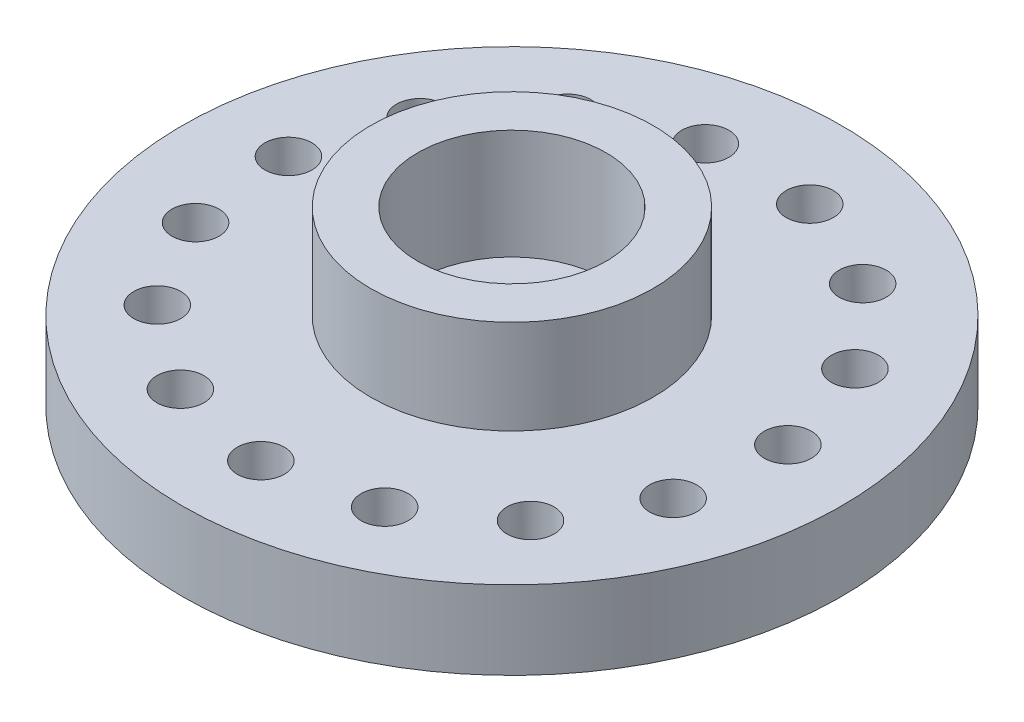
ISO-10303-21;
HEADER;
FILE_DESCRIPTION(('STEP AP214'),'2;1');
FILE_NAME('part.step','',(''),(''),'','','');
FILE_SCHEMA(('AUTOMOTIVE_DESIGN { 1 0 10303 214 1 1 1 1 }'));
ENDSEC;
DATA;
#1=APPLICATION_CONTEXT('core data for automotive mechanical design processes');
#2=APPLICATION_PROTOCOL_DEFINITION('international standard','automotive_design',2000,#1);
#3=PRODUCT_CONTEXT('',#1,'mechanical');
#4=PRODUCT('Part','Part','',(#3));
#5=PRODUCT_RELATED_PRODUCT_CATEGORY('part','',(#4));
#6=PRODUCT_DEFINITION_FORMATION('','',#4);
#7=PRODUCT_DEFINITION_CONTEXT('part definition',#1,'design');
#8=PRODUCT_DEFINITION('design','',#6,#7);
#9=PRODUCT_DEFINITION_SHAPE('','',#8);
#10=(LENGTH_UNIT() NAMED_UNIT(*) SI_UNIT(.MILLI.,.METRE.));
#11=(NAMED_UNIT(*) PLANE_ANGLE_UNIT() SI_UNIT($,.RADIAN.));
#12=(NAMED_UNIT(*) SI_UNIT($,.STERADIAN.) SOLID_ANGLE_UNIT());
#13=UNCERTAINTY_MEASURE_WITH_UNIT(LENGTH_MEASURE(1.E-05),#10,'distance_accuracy_value','');
#14=(GEOMETRIC_REPRESENTATION_CONTEXT(3) GLOBAL_UNCERTAINTY_ASSIGNED_CONTEXT((#13)) GLOBAL_UNIT_ASSIGNED_CONTEXT((#10,
#11,#12)) REPRESENTATION_CONTEXT('',''));
#15=CARTESIAN_POINT('',(0.,0.,0.));
#16=DIRECTION('',(0.,0.,1.));
#17=DIRECTION('',(1.,0.,0.));
#18=AXIS2_PLACEMENT_3D('',#15,#16,#17);
#19=CARTESIAN_POINT('',(0.,2.5,0.));
#20=DIRECTION('',(0.,1.,0.));
#21=DIRECTION('',(0.,0.,1.));
#22=AXIS2_PLACEMENT_3D('',#19,#20,#21);
#23=PLANE('',#22);
#24=CARTESIAN_POINT('',(-3.25389314460638,2.5,7.30836366114067));
#25=DIRECTION('',(0.,1.,0.));
#26=DIRECTION('',(0.,0.,1.));
#27=AXIS2_PLACEMENT_3D('',#24,#25,#26);
#28=CIRCLE('',#27,0.750000000000171);
#29=CARTESIAN_POINT('',(-3.25389314460638,2.5,8.05836366114084));
#30=VERTEX_POINT('',#29);
#31=EDGE_CURVE('E141',#30,#30,#28,.T.);
#32=ORIENTED_EDGE('',*,*,#31,.F.);
#33=EDGE_LOOP('',(#32));
#34=FACE_BOUND('',#33,.T.);
#35=CARTESIAN_POINT('',(-5.94515860381904,2.5,5.35304485087061));
#36=DIRECTION('',(0.,1.,0.));
#37=DIRECTION('',(0.,0.,1.));
#38=AXIS2_PLACEMENT_3D('',#35,#36,#37);
#39=CIRCLE('',#38,0.750000000000277);
#40=CARTESIAN_POINT('',(-5.94515860381904,2.5,6.10304485087089));
#41=VERTEX_POINT('',#40);
#42=EDGE_CURVE('E135',#41,#41,#39,.T.);
#43=ORIENTED_EDGE('',*,*,#42,.F.);
#44=EDGE_LOOP('',(#43));
#45=FACE_BOUND('',#44,.T.);
#46=CARTESIAN_POINT('',(-7.60845213036099,2.5,2.47213595499925));
#47=DIRECTION('',(0.,1.,0.));
#48=DIRECTION('',(0.,0.,1.));
#49=AXIS2_PLACEMENT_3D('',#46,#47,#48);
#50=CIRCLE('',#49,0.750000000000401);
#51=CARTESIAN_POINT('',(-7.60845213036099,2.5,3.22213595499966));
#52=VERTEX_POINT('',#51);
#53=EDGE_CURVE('E129',#52,#52,#50,.T.);
#54=ORIENTED_EDGE('',*,*,#53,.F.);
#55=EDGE_LOOP('',(#54));
#56=FACE_BOUND('',#55,.T.);
#57=CARTESIAN_POINT('',(-7.95617516294581,2.5,-0.836227706141572));
#58=DIRECTION('',(0.,1.,0.));
#59=DIRECTION('',(0.,0.,1.));
#60=AXIS2_PLACEMENT_3D('',#57,#58,#59);
#61=CIRCLE('',#60,0.750000000000539);
#62=CARTESIAN_POINT('',(-7.95617516294581,2.5,-0.0862277061410326));
#63=VERTEX_POINT('',#62);
#64=EDGE_CURVE('E123',#63,#63,#61,.T.);
#65=ORIENTED_EDGE('',*,*,#64,.F.);
#66=EDGE_LOOP('',(#65));
#67=FACE_BOUND('',#66,.T.);
#68=CARTESIAN_POINT('',(-6.928203230275,2.5,-4.0000000000003));
#69=DIRECTION('',(0.,1.,0.));
#70=DIRECTION('',(0.,0.,1.));
#71=AXIS2_PLACEMENT_3D('',#68,#69,#70);
#72=CIRCLE('',#71,0.750000000000647);
#73=CARTESIAN_POINT('',(-6.928203230275,2.5,-3.24999999999965));
#74=VERTEX_POINT('',#73);
#75=EDGE_CURVE('E117',#74,#74,#72,.T.);
#76=ORIENTED_EDGE('',*,*,#75,.F.);
#77=EDGE_LOOP('',(#76));
#78=FACE_BOUND('',#77,.T.);
#79=CARTESIAN_POINT('',(-4.70228201833917,2.5,-6.47213595499978));
#80=DIRECTION('',(0.,1.,0.));
#81=DIRECTION('',(0.,0.,1.));
#82=AXIS2_PLACEMENT_3D('',#79,#80,#81);
#83=CIRCLE('',#82,0.750000000000711);
#84=CARTESIAN_POINT('',(-4.70228201833917,2.5,-5.72213595499907));
#85=VERTEX_POINT('',#84);
#86=EDGE_CURVE('E111',#85,#85,#83,.T.);
#87=ORIENTED_EDGE('',*,*,#86,.F.);
#88=EDGE_LOOP('',(#87));
#89=FACE_BOUND('',#88,.T.);
#90=CARTESIAN_POINT('',(-1.6632935265414,2.5,-7.82518080587052));
#91=DIRECTION('',(0.,1.,0.));
#92=DIRECTION('',(0.,0.,1.));
#93=AXIS2_PLACEMENT_3D('',#90,#91,#92);
#94=CIRCLE('',#93,0.750000000000721);
#95=CARTESIAN_POINT('',(-1.6632935265414,2.5,-7.0751808058698));
#96=VERTEX_POINT('',#95);
#97=EDGE_CURVE('E105',#96,#96,#94,.T.);
#98=ORIENTED_EDGE('',*,*,#97,.F.);
#99=EDGE_LOOP('',(#98));
#100=FACE_BOUND('',#99,.T.);
#101=CARTESIAN_POINT('',(1.66329352654275,2.5,-7.82518080587037));
#102=DIRECTION('',(0.,1.,0.));
#103=DIRECTION('',(0.,0.,1.));
#104=AXIS2_PLACEMENT_3D('',#101,#102,#103);
#105=CIRCLE('',#104,0.750000000000672);
#106=CARTESIAN_POINT('',(1.66329352654275,2.5,-7.0751808058697));
#107=VERTEX_POINT('',#106);
#108=EDGE_CURVE('E99',#107,#107,#105,.T.);
#109=ORIENTED_EDGE('',*,*,#108,.F.);
#110=EDGE_LOOP('',(#109));
#111=FACE_BOUND('',#110,.T.);
#112=CARTESIAN_POINT('',(4.7022820183404,2.5,-6.47213595499938));
#113=DIRECTION('',(0.,1.,0.));
#114=DIRECTION('',(0.,0.,1.));
#115=AXIS2_PLACEMENT_3D('',#112,#113,#114);
#116=CIRCLE('',#115,0.750000000000571);
#117=CARTESIAN_POINT('',(4.7022820183404,2.5,-5.72213595499881));
#118=VERTEX_POINT('',#117);
#119=EDGE_CURVE('E93',#118,#118,#116,.T.);
#120=ORIENTED_EDGE('',*,*,#119,.F.);
#121=EDGE_LOOP('',(#120));
#122=FACE_BOUND('',#121,.T.);
#123=CARTESIAN_POINT('',(6.92820323027602,2.5,-3.9999999999997));
#124=DIRECTION('',(0.,1.,0.));
#125=DIRECTION('',(0.,0.,1.));
#126=AXIS2_PLACEMENT_3D('',#123,#124,#125);
#127=CIRCLE('',#126,0.750000000000439);
#128=CARTESIAN_POINT('',(6.92820323027602,2.5,-3.24999999999927));
#129=VERTEX_POINT('',#128);
#130=EDGE_CURVE('E87',#129,#129,#127,.T.);
#131=ORIENTED_EDGE('',*,*,#130,.F.);
#132=EDGE_LOOP('',(#131));
#133=FACE_BOUND('',#132,.T.);
#134=CARTESIAN_POINT('',(7.95617516294656,2.5,-0.836227706140889));
#135=DIRECTION('',(0.,1.,0.));
#136=DIRECTION('',(0.,0.,1.));
#137=AXIS2_PLACEMENT_3D('',#134,#135,#136);
#138=CIRCLE('',#137,0.750000000000289);
#139=CARTESIAN_POINT('',(7.95617516294656,2.5,-0.0862277061405998));
#140=VERTEX_POINT('',#139);
#141=EDGE_CURVE('E81',#140,#140,#138,.T.);
#142=ORIENTED_EDGE('',*,*,#141,.F.);
#143=EDGE_LOOP('',(#142));
#144=FACE_BOUND('',#143,.T.);
#145=CARTESIAN_POINT('',(7.60845213036146,2.5,2.4721359549999));
#146=DIRECTION('',(0.,1.,0.));
#147=DIRECTION('',(0.,0.,1.));
#148=AXIS2_PLACEMENT_3D('',#145,#146,#147);
#149=CIRCLE('',#148,0.75000000000015);
#150=CARTESIAN_POINT('',(7.60845213036146,2.5,3.22213595500005));
#151=VERTEX_POINT('',#150);
#152=EDGE_CURVE('E75',#151,#151,#149,.T.);
#153=ORIENTED_EDGE('',*,*,#152,.F.);
#154=EDGE_LOOP('',(#153));
#155=FACE_BOUND('',#154,.T.);
#156=CARTESIAN_POINT('',(5.94515860381927,2.5,5.35304485087112));
#157=DIRECTION('',(0.,1.,0.));
#158=DIRECTION('',(0.,0.,1.));
#159=AXIS2_PLACEMENT_3D('',#156,#157,#158);
#160=CIRCLE('',#159,0.750000000000048);
#161=CARTESIAN_POINT('',(5.94515860381927,2.5,6.10304485087117));
#162=VERTEX_POINT('',#161);
#163=EDGE_CURVE('E69',#162,#162,#160,.T.);
#164=ORIENTED_EDGE('',*,*,#163,.F.);
#165=EDGE_LOOP('',(#164));
#166=FACE_BOUND('',#165,.T.);
#167=CARTESIAN_POINT('',(3.25389314460641,2.5,7.3083636611408));
#168=DIRECTION('',(0.,1.,0.));
#169=DIRECTION('',(0.,0.,1.));
#170=AXIS2_PLACEMENT_3D('',#167,#168,#169);
#171=CIRCLE('',#170,0.75);
#172=CARTESIAN_POINT('',(3.25389314460641,2.5,8.0583636611408));
#173=VERTEX_POINT('',#172);
#174=EDGE_CURVE('E63',#173,#173,#171,.T.);
#175=ORIENTED_EDGE('',*,*,#174,.F.);
#176=EDGE_LOOP('',(#175));
#177=FACE_BOUND('',#176,.T.);
#178=CARTESIAN_POINT('',(0.,2.5,8.));
#179=DIRECTION('',(0.,1.,0.));
#180=DIRECTION('',(0.,0.,1.));
#181=AXIS2_PLACEMENT_3D('',#178,#179,#180);
#182=CIRCLE('',#181,0.75);
#183=CARTESIAN_POINT('',(0.,2.5,8.75));
#184=VERTEX_POINT('',#183);
#185=EDGE_CURVE('E55',#184,#184,#182,.T.);
#186=ORIENTED_EDGE('',*,*,#185,.F.);
#187=EDGE_LOOP('',(#186));
#188=FACE_BOUND('',#187,.T.);
#189=CARTESIAN_POINT('',(0.,2.5,0.));
#190=DIRECTION('',(0.,1.,0.));
#191=DIRECTION('',(0.,0.,1.));
#192=AXIS2_PLACEMENT_3D('',#189,#190,#191);
#193=CIRCLE('',#192,10.5);
#194=CARTESIAN_POINT('',(0.,2.5,10.5));
#195=VERTEX_POINT('',#194);
#196=EDGE_CURVE('E10',#195,#195,#193,.T.);
#197=ORIENTED_EDGE('',*,*,#196,.T.);
#198=EDGE_LOOP('',(#197));
#199=FACE_BOUND('',#198,.T.);
#200=CARTESIAN_POINT('',(0.,2.5,0.));
#201=DIRECTION('',(0.,1.,0.));
#202=DIRECTION('',(0.,0.,1.));
#203=AXIS2_PLACEMENT_3D('',#200,#201,#202);
#204=CIRCLE('',#203,4.5);
#205=CARTESIAN_POINT('',(0.,2.5,4.5));
#206=VERTEX_POINT('',#205);
#207=EDGE_CURVE('E46',#206,#206,#204,.T.);
#208=ORIENTED_EDGE('',*,*,#207,.F.);
#209=EDGE_LOOP('',(#208));
#210=FACE_BOUND('',#209,.T.);
#211=ADVANCED_FACE('F33',(#34,#45,#56,#67,#78,#89,#100,#111,#122,#133,#144,#155,#166,#177,#188,
#199,#210),#23,.T.);
#212=CARTESIAN_POINT('',(0.,2.5,0.));
#213=DIRECTION('',(0.,-1.,0.));
#214=DIRECTION('',(0.,0.,-1.));
#215=AXIS2_PLACEMENT_3D('',#212,#213,#214);
#216=CYLINDRICAL_SURFACE('',#215,10.5);
#217=ORIENTED_EDGE('',*,*,#196,.F.);
#218=EDGE_LOOP('',(#217));
#219=FACE_BOUND('',#218,.T.);
#220=CARTESIAN_POINT('',(0.,0.,0.));
#221=DIRECTION('',(0.,1.,0.));
#222=DIRECTION('',(0.,0.,1.));
#223=AXIS2_PLACEMENT_3D('',#220,#221,#222);
#224=CIRCLE('',#223,10.5);
#225=CARTESIAN_POINT('',(0.,0.,10.5));
#226=VERTEX_POINT('',#225);
#227=EDGE_CURVE('E37',#226,#226,#224,.T.);
#228=ORIENTED_EDGE('',*,*,#227,.T.);
#229=EDGE_LOOP('',(#228));
#230=FACE_BOUND('',#229,.T.);
#231=ADVANCED_FACE('F35',(#219,#230),#216,.T.);
#232=CARTESIAN_POINT('',(0.,0.,0.));
#233=DIRECTION('',(0.,1.,0.));
#234=DIRECTION('',(0.,0.,1.));
#235=AXIS2_PLACEMENT_3D('',#232,#233,#234);
#236=PLANE('',#235);
#237=CARTESIAN_POINT('',(-3.25389314460638,0.,7.30836366114067));
#238=DIRECTION('',(0.,-1.,0.));
#239=DIRECTION('',(0.,0.,-1.));
#240=AXIS2_PLACEMENT_3D('',#237,#238,#239);
#241=CIRCLE('',#240,0.750000000000171);
#242=CARTESIAN_POINT('',(-3.25389314460638,0.,6.5583636611405));
#243=VERTEX_POINT('',#242);
#244=EDGE_CURVE('E144',#243,#243,#241,.T.);
#245=ORIENTED_EDGE('',*,*,#244,.F.);
#246=EDGE_LOOP('',(#245));
#247=FACE_BOUND('',#246,.T.);
#248=CARTESIAN_POINT('',(-5.94515860381904,0.,5.35304485087061));
#249=DIRECTION('',(0.,-1.,0.));
#250=DIRECTION('',(0.,0.,-1.));
#251=AXIS2_PLACEMENT_3D('',#248,#249,#250);
#252=CIRCLE('',#251,0.750000000000277);
#253=CARTESIAN_POINT('',(-5.94515860381904,0.,4.60304485087033));
#254=VERTEX_POINT('',#253);
#255=EDGE_CURVE('E138',#254,#254,#252,.T.);
#256=ORIENTED_EDGE('',*,*,#255,.F.);
#257=EDGE_LOOP('',(#256));
#258=FACE_BOUND('',#257,.T.);
#259=CARTESIAN_POINT('',(-7.60845213036099,0.,2.47213595499925));
#260=DIRECTION('',(0.,-1.,0.));
#261=DIRECTION('',(0.,0.,-1.));
#262=AXIS2_PLACEMENT_3D('',#259,#260,#261);
#263=CIRCLE('',#262,0.750000000000401);
#264=CARTESIAN_POINT('',(-7.60845213036099,0.,1.72213595499885));
#265=VERTEX_POINT('',#264);
#266=EDGE_CURVE('E132',#265,#265,#263,.T.);
#267=ORIENTED_EDGE('',*,*,#266,.F.);
#268=EDGE_LOOP('',(#267));
#269=FACE_BOUND('',#268,.T.);
#270=CARTESIAN_POINT('',(-7.95617516294581,0.,-0.836227706141572));
#271=DIRECTION('',(0.,-1.,0.));
#272=DIRECTION('',(0.,0.,-1.));
#273=AXIS2_PLACEMENT_3D('',#270,#271,#272);
#274=CIRCLE('',#273,0.750000000000539);
#275=CARTESIAN_POINT('',(-7.95617516294581,0.,-1.58622770614211));
#276=VERTEX_POINT('',#275);
#277=EDGE_CURVE('E126',#276,#276,#274,.T.);
#278=ORIENTED_EDGE('',*,*,#277,.F.);
#279=EDGE_LOOP('',(#278));
#280=FACE_BOUND('',#279,.T.);
#281=CARTESIAN_POINT('',(-6.928203230275,0.,-4.0000000000003));
#282=DIRECTION('',(0.,-1.,0.));
#283=DIRECTION('',(0.,0.,-1.));
#284=AXIS2_PLACEMENT_3D('',#281,#282,#283);
#285=CIRCLE('',#284,0.750000000000647);
#286=CARTESIAN_POINT('',(-6.928203230275,0.,-4.75000000000095));
#287=VERTEX_POINT('',#286);
#288=EDGE_CURVE('E120',#287,#287,#285,.T.);
#289=ORIENTED_EDGE('',*,*,#288,.F.);
#290=EDGE_LOOP('',(#289));
#291=FACE_BOUND('',#290,.T.);
#292=CARTESIAN_POINT('',(-4.70228201833917,0.,-6.47213595499978));
#293=DIRECTION('',(0.,-1.,0.));
#294=DIRECTION('',(0.,0.,-1.));
#295=AXIS2_PLACEMENT_3D('',#292,#293,#294);
#296=CIRCLE('',#295,0.750000000000711);
#297=CARTESIAN_POINT('',(-4.70228201833917,0.,-7.22213595500049));
#298=VERTEX_POINT('',#297);
#299=EDGE_CURVE('E114',#298,#298,#296,.T.);
#300=ORIENTED_EDGE('',*,*,#299,.F.);
#301=EDGE_LOOP('',(#300));
#302=FACE_BOUND('',#301,.T.);
#303=CARTESIAN_POINT('',(-1.6632935265414,0.,-7.82518080587052));
#304=DIRECTION('',(0.,-1.,0.));
#305=DIRECTION('',(0.,0.,-1.));
#306=AXIS2_PLACEMENT_3D('',#303,#304,#305);
#307=CIRCLE('',#306,0.750000000000721);
#308=CARTESIAN_POINT('',(-1.6632935265414,0.,-8.57518080587124));
#309=VERTEX_POINT('',#308);
#310=EDGE_CURVE('E108',#309,#309,#307,.T.);
#311=ORIENTED_EDGE('',*,*,#310,.F.);
#312=EDGE_LOOP('',(#311));
#313=FACE_BOUND('',#312,.T.);
#314=CARTESIAN_POINT('',(1.66329352654275,0.,-7.82518080587037));
#315=DIRECTION('',(0.,-1.,0.));
#316=DIRECTION('',(0.,0.,-1.));
#317=AXIS2_PLACEMENT_3D('',#314,#315,#316);
#318=CIRCLE('',#317,0.750000000000672);
#319=CARTESIAN_POINT('',(1.66329352654275,0.,-8.57518080587105));
#320=VERTEX_POINT('',#319);
#321=EDGE_CURVE('E102',#320,#320,#318,.T.);
#322=ORIENTED_EDGE('',*,*,#321,.F.);
#323=EDGE_LOOP('',(#322));
#324=FACE_BOUND('',#323,.T.);
#325=CARTESIAN_POINT('',(4.7022820183404,0.,-6.47213595499938));
#326=DIRECTION('',(0.,-1.,0.));
#327=DIRECTION('',(0.,0.,-1.));
#328=AXIS2_PLACEMENT_3D('',#325,#326,#327);
#329=CIRCLE('',#328,0.750000000000571);
#330=CARTESIAN_POINT('',(4.7022820183404,0.,-7.22213595499995));
#331=VERTEX_POINT('',#330);
#332=EDGE_CURVE('E96',#331,#331,#329,.T.);
#333=ORIENTED_EDGE('',*,*,#332,.F.);
#334=EDGE_LOOP('',(#333));
#335=FACE_BOUND('',#334,.T.);
#336=CARTESIAN_POINT('',(6.92820323027602,0.,-3.9999999999997));
#337=DIRECTION('',(0.,-1.,0.));
#338=DIRECTION('',(0.,0.,-1.));
#339=AXIS2_PLACEMENT_3D('',#336,#337,#338);
#340=CIRCLE('',#339,0.750000000000439);
#341=CARTESIAN_POINT('',(6.92820323027602,0.,-4.75000000000014));
#342=VERTEX_POINT('',#341);
#343=EDGE_CURVE('E90',#342,#342,#340,.T.);
#344=ORIENTED_EDGE('',*,*,#343,.F.);
#345=EDGE_LOOP('',(#344));
#346=FACE_BOUND('',#345,.T.);
#347=CARTESIAN_POINT('',(7.95617516294656,0.,-0.836227706140889));
#348=DIRECTION('',(0.,-1.,0.));
#349=DIRECTION('',(0.,0.,-1.));
#350=AXIS2_PLACEMENT_3D('',#347,#348,#349);
#351=CIRCLE('',#350,0.750000000000289);
#352=CARTESIAN_POINT('',(7.95617516294656,0.,-1.58622770614118));
#353=VERTEX_POINT('',#352);
#354=EDGE_CURVE('E84',#353,#353,#351,.T.);
#355=ORIENTED_EDGE('',*,*,#354,.F.);
#356=EDGE_LOOP('',(#355));
#357=FACE_BOUND('',#356,.T.);
#358=CARTESIAN_POINT('',(7.60845213036146,0.,2.4721359549999));
#359=DIRECTION('',(0.,-1.,0.));
#360=DIRECTION('',(0.,0.,-1.));
#361=AXIS2_PLACEMENT_3D('',#358,#359,#360);
#362=CIRCLE('',#361,0.75000000000015);
#363=CARTESIAN_POINT('',(7.60845213036146,0.,1.72213595499975));
#364=VERTEX_POINT('',#363);
#365=EDGE_CURVE('E78',#364,#364,#362,.T.);
#366=ORIENTED_EDGE('',*,*,#365,.F.);
#367=EDGE_LOOP('',(#366));
#368=FACE_BOUND('',#367,.T.);
#369=CARTESIAN_POINT('',(5.94515860381927,0.,5.35304485087112));
#370=DIRECTION('',(0.,-1.,0.));
#371=DIRECTION('',(0.,0.,-1.));
#372=AXIS2_PLACEMENT_3D('',#369,#370,#371);
#373=CIRCLE('',#372,0.750000000000048);
#374=CARTESIAN_POINT('',(5.94515860381927,0.,4.60304485087107));
#375=VERTEX_POINT('',#374);
#376=EDGE_CURVE('E72',#375,#375,#373,.T.);
#377=ORIENTED_EDGE('',*,*,#376,.F.);
#378=EDGE_LOOP('',(#377));
#379=FACE_BOUND('',#378,.T.);
#380=CARTESIAN_POINT('',(3.25389314460641,0.,7.3083636611408));
#381=DIRECTION('',(0.,-1.,0.));
#382=DIRECTION('',(0.,0.,-1.));
#383=AXIS2_PLACEMENT_3D('',#380,#381,#382);
#384=CIRCLE('',#383,0.75);
#385=CARTESIAN_POINT('',(3.25389314460641,0.,6.5583636611408));
#386=VERTEX_POINT('',#385);
#387=EDGE_CURVE('E66',#386,#386,#384,.T.);
#388=ORIENTED_EDGE('',*,*,#387,.F.);
#389=EDGE_LOOP('',(#388));
#390=FACE_BOUND('',#389,.T.);
#391=CARTESIAN_POINT('',(0.,0.,8.));
#392=DIRECTION('',(0.,-1.,0.));
#393=DIRECTION('',(0.,0.,-1.));
#394=AXIS2_PLACEMENT_3D('',#391,#392,#393);
#395=CIRCLE('',#394,0.75);
#396=CARTESIAN_POINT('',(0.,0.,7.25));
#397=VERTEX_POINT('',#396);
#398=EDGE_CURVE('E60',#397,#397,#395,.T.);
#399=ORIENTED_EDGE('',*,*,#398,.F.);
#400=EDGE_LOOP('',(#399));
#401=FACE_BOUND('',#400,.T.);
#402=ORIENTED_EDGE('',*,*,#227,.F.);
#403=EDGE_LOOP('',(#402));
#404=FACE_BOUND('',#403,.T.);
#405=ADVANCED_FACE('F150',(#247,#258,#269,#280,#291,#302,#313,#324,#335,#346,#357,#368,#379,
#390,#401,#404),#236,.F.);
#406=CARTESIAN_POINT('',(0.,5.5,0.));
#407=DIRECTION('',(0.,-1.,0.));
#408=DIRECTION('',(0.,0.,-1.));
#409=AXIS2_PLACEMENT_3D('',#406,#407,#408);
#410=CYLINDRICAL_SURFACE('',#409,4.5);
#411=CARTESIAN_POINT('',(0.,5.5,0.));
#412=DIRECTION('',(0.,1.,0.));
#413=DIRECTION('',(0.,0.,1.));
#414=AXIS2_PLACEMENT_3D('',#411,#412,#413);
#415=CIRCLE('',#414,4.5);
#416=CARTESIAN_POINT('',(0.,5.5,4.5));
#417=VERTEX_POINT('',#416);
#418=EDGE_CURVE('E44',#417,#417,#415,.T.);
#419=ORIENTED_EDGE('',*,*,#418,.F.);
#420=EDGE_LOOP('',(#419));
#421=FACE_BOUND('',#420,.T.);
#422=ORIENTED_EDGE('',*,*,#207,.T.);
#423=EDGE_LOOP('',(#422));
#424=FACE_BOUND('',#423,.T.);
#425=ADVANCED_FACE('F153',(#421,#424),#410,.T.);
#426=CARTESIAN_POINT('',(0.,5.5,0.));
#427=DIRECTION('',(0.,1.,0.));
#428=DIRECTION('',(0.,0.,1.));
#429=AXIS2_PLACEMENT_3D('',#426,#427,#428);
#430=PLANE('',#429);
#431=CARTESIAN_POINT('',(0.,5.5,0.));
#432=DIRECTION('',(0.,1.,0.));
#433=DIRECTION('',(0.,0.,1.));
#434=AXIS2_PLACEMENT_3D('',#431,#432,#433);
#435=CIRCLE('',#434,3.);
#436=CARTESIAN_POINT('',(0.,5.5,3.));
#437=VERTEX_POINT('',#436);
#438=EDGE_CURVE('E52',#437,#437,#435,.T.);
#439=ORIENTED_EDGE('',*,*,#438,.F.);
#440=EDGE_LOOP('',(#439));
#441=FACE_BOUND('',#440,.T.);
#442=ORIENTED_EDGE('',*,*,#418,.T.);
#443=EDGE_LOOP('',(#442));
#444=FACE_BOUND('',#443,.T.);
#445=ADVANCED_FACE('F198',(#441,#444),#430,.T.);
#446=CARTESIAN_POINT('',(0.,2.,0.));
#447=DIRECTION('',(0.,1.,0.));
#448=DIRECTION('',(0.,0.,1.));
#449=AXIS2_PLACEMENT_3D('',#446,#447,#448);
#450=CYLINDRICAL_SURFACE('',#449,3.);
#451=CARTESIAN_POINT('',(0.,2.,0.));
#452=DIRECTION('',(0.,1.,0.));
#453=DIRECTION('',(0.,0.,1.));
#454=AXIS2_PLACEMENT_3D('',#451,#452,#453);
#455=CIRCLE('',#454,3.);
#456=CARTESIAN_POINT('',(0.,2.,3.));
#457=VERTEX_POINT('',#456);
#458=EDGE_CURVE('E49',#457,#457,#455,.T.);
#459=ORIENTED_EDGE('',*,*,#458,.F.);
#460=EDGE_LOOP('',(#459));
#461=FACE_BOUND('',#460,.T.);
#462=ORIENTED_EDGE('',*,*,#438,.T.);
#463=EDGE_LOOP('',(#462));
#464=FACE_BOUND('',#463,.T.);
#465=ADVANCED_FACE('F202',(#461,#464),#450,.F.);
#466=CARTESIAN_POINT('',(0.,2.,0.));
#467=DIRECTION('',(0.,1.,0.));
#468=DIRECTION('',(0.,0.,1.));
#469=AXIS2_PLACEMENT_3D('',#466,#467,#468);
#470=PLANE('',#469);
#471=ORIENTED_EDGE('',*,*,#458,.T.);
#472=EDGE_LOOP('',(#471));
#473=FACE_BOUND('',#472,.T.);
#474=ADVANCED_FACE('F206',(#473),#470,.T.);
#475=CARTESIAN_POINT('',(0.,4.,8.));
#476=DIRECTION('',(0.,-1.,0.));
#477=DIRECTION('',(0.,0.,-1.));
#478=AXIS2_PLACEMENT_3D('',#475,#476,#477);
#479=CYLINDRICAL_SURFACE('',#478,0.75);
#480=ORIENTED_EDGE('',*,*,#185,.T.);
#481=EDGE_LOOP('',(#480));
#482=FACE_BOUND('',#481,.T.);
#483=ORIENTED_EDGE('',*,*,#398,.T.);
#484=EDGE_LOOP('',(#483));
#485=FACE_BOUND('',#484,.T.);
#486=ADVANCED_FACE('F210',(#482,#485),#479,.F.);
#487=CARTESIAN_POINT('',(3.25389314460641,4.,7.3083636611408));
#488=DIRECTION('',(0.,-1.,0.));
#489=DIRECTION('',(0.,0.,-1.));
#490=AXIS2_PLACEMENT_3D('',#487,#488,#489);
#491=CYLINDRICAL_SURFACE('',#490,0.75);
#492=ORIENTED_EDGE('',*,*,#174,.T.);
#493=EDGE_LOOP('',(#492));
#494=FACE_BOUND('',#493,.T.);
#495=ORIENTED_EDGE('',*,*,#387,.T.);
#496=EDGE_LOOP('',(#495));
#497=FACE_BOUND('',#496,.T.);
#498=ADVANCED_FACE('F214',(#494,#497),#491,.F.);
#499=CARTESIAN_POINT('',(5.94515860381927,4.,5.35304485087112));
#500=DIRECTION('',(0.,-1.,0.));
#501=DIRECTION('',(0.,0.,-1.));
#502=AXIS2_PLACEMENT_3D('',#499,#500,#501);
#503=CYLINDRICAL_SURFACE('',#502,0.750000000000048);
#504=ORIENTED_EDGE('',*,*,#163,.T.);
#505=EDGE_LOOP('',(#504));
#506=FACE_BOUND('',#505,.T.);
#507=ORIENTED_EDGE('',*,*,#376,.T.);
#508=EDGE_LOOP('',(#507));
#509=FACE_BOUND('',#508,.T.);
#510=ADVANCED_FACE('F218',(#506,#509),#503,.F.);
#511=CARTESIAN_POINT('',(7.60845213036146,4.,2.4721359549999));
#512=DIRECTION('',(0.,-1.,0.));
#513=DIRECTION('',(0.,0.,-1.));
#514=AXIS2_PLACEMENT_3D('',#511,#512,#513);
#515=CYLINDRICAL_SURFACE('',#514,0.75000000000015);
#516=ORIENTED_EDGE('',*,*,#152,.T.);
#517=EDGE_LOOP('',(#516));
#518=FACE_BOUND('',#517,.T.);
#519=ORIENTED_EDGE('',*,*,#365,.T.);
#520=EDGE_LOOP('',(#519));
#521=FACE_BOUND('',#520,.T.);
#522=ADVANCED_FACE('F222',(#518,#521),#515,.F.);
#523=CARTESIAN_POINT('',(7.95617516294656,4.,-0.836227706140889));
#524=DIRECTION('',(0.,-1.,0.));
#525=DIRECTION('',(0.,0.,-1.));
#526=AXIS2_PLACEMENT_3D('',#523,#524,#525);
#527=CYLINDRICAL_SURFACE('',#526,0.750000000000289);
#528=ORIENTED_EDGE('',*,*,#141,.T.);
#529=EDGE_LOOP('',(#528));
#530=FACE_BOUND('',#529,.T.);
#531=ORIENTED_EDGE('',*,*,#354,.T.);
#532=EDGE_LOOP('',(#531));
#533=FACE_BOUND('',#532,.T.);
#534=ADVANCED_FACE('F226',(#530,#533),#527,.F.);
#535=CARTESIAN_POINT('',(6.92820323027602,4.,-3.9999999999997));
#536=DIRECTION('',(0.,-1.,0.));
#537=DIRECTION('',(0.,0.,-1.));
#538=AXIS2_PLACEMENT_3D('',#535,#536,#537);
#539=CYLINDRICAL_SURFACE('',#538,0.750000000000439);
#540=ORIENTED_EDGE('',*,*,#130,.T.);
#541=EDGE_LOOP('',(#540));
#542=FACE_BOUND('',#541,.T.);
#543=ORIENTED_EDGE('',*,*,#343,.T.);
#544=EDGE_LOOP('',(#543));
#545=FACE_BOUND('',#544,.T.);
#546=ADVANCED_FACE('F230',(#542,#545),#539,.F.);
#547=CARTESIAN_POINT('',(4.7022820183404,4.,-6.47213595499938));
#548=DIRECTION('',(0.,-1.,0.));
#549=DIRECTION('',(0.,0.,-1.));
#550=AXIS2_PLACEMENT_3D('',#547,#548,#549);
#551=CYLINDRICAL_SURFACE('',#550,0.750000000000571);
#552=ORIENTED_EDGE('',*,*,#119,.T.);
#553=EDGE_LOOP('',(#552));
#554=FACE_BOUND('',#553,.T.);
#555=ORIENTED_EDGE('',*,*,#332,.T.);
#556=EDGE_LOOP('',(#555));
#557=FACE_BOUND('',#556,.T.);
#558=ADVANCED_FACE('F234',(#554,#557),#551,.F.);
#559=CARTESIAN_POINT('',(1.66329352654275,4.,-7.82518080587037));
#560=DIRECTION('',(0.,-1.,0.));
#561=DIRECTION('',(0.,0.,-1.));
#562=AXIS2_PLACEMENT_3D('',#559,#560,#561);
#563=CYLINDRICAL_SURFACE('',#562,0.750000000000672);
#564=ORIENTED_EDGE('',*,*,#108,.T.);
#565=EDGE_LOOP('',(#564));
#566=FACE_BOUND('',#565,.T.);
#567=ORIENTED_EDGE('',*,*,#321,.T.);
#568=EDGE_LOOP('',(#567));
#569=FACE_BOUND('',#568,.T.);
#570=ADVANCED_FACE('F238',(#566,#569),#563,.F.);
#571=CARTESIAN_POINT('',(-1.6632935265414,4.,-7.82518080587052));
#572=DIRECTION('',(0.,-1.,0.));
#573=DIRECTION('',(0.,0.,-1.));
#574=AXIS2_PLACEMENT_3D('',#571,#572,#573);
#575=CYLINDRICAL_SURFACE('',#574,0.750000000000721);
#576=ORIENTED_EDGE('',*,*,#97,.T.);
#577=EDGE_LOOP('',(#576));
#578=FACE_BOUND('',#577,.T.);
#579=ORIENTED_EDGE('',*,*,#310,.T.);
#580=EDGE_LOOP('',(#579));
#581=FACE_BOUND('',#580,.T.);
#582=ADVANCED_FACE('F242',(#578,#581),#575,.F.);
#583=CARTESIAN_POINT('',(-4.70228201833917,4.,-6.47213595499978));
#584=DIRECTION('',(0.,-1.,0.));
#585=DIRECTION('',(0.,0.,-1.));
#586=AXIS2_PLACEMENT_3D('',#583,#584,#585);
#587=CYLINDRICAL_SURFACE('',#586,0.750000000000711);
#588=ORIENTED_EDGE('',*,*,#86,.T.);
#589=EDGE_LOOP('',(#588));
#590=FACE_BOUND('',#589,.T.);
#591=ORIENTED_EDGE('',*,*,#299,.T.);
#592=EDGE_LOOP('',(#591));
#593=FACE_BOUND('',#592,.T.);
#594=ADVANCED_FACE('F246',(#590,#593),#587,.F.);
#595=CARTESIAN_POINT('',(-6.928203230275,4.,-4.0000000000003));
#596=DIRECTION('',(0.,-1.,0.));
#597=DIRECTION('',(0.,0.,-1.));
#598=AXIS2_PLACEMENT_3D('',#595,#596,#597);
#599=CYLINDRICAL_SURFACE('',#598,0.750000000000647);
#600=ORIENTED_EDGE('',*,*,#75,.T.);
#601=EDGE_LOOP('',(#600));
#602=FACE_BOUND('',#601,.T.);
#603=ORIENTED_EDGE('',*,*,#288,.T.);
#604=EDGE_LOOP('',(#603));
#605=FACE_BOUND('',#604,.T.);
#606=ADVANCED_FACE('F250',(#602,#605),#599,.F.);
#607=CARTESIAN_POINT('',(-7.95617516294581,4.,-0.836227706141572));
#608=DIRECTION('',(0.,-1.,0.));
#609=DIRECTION('',(0.,0.,-1.));
#610=AXIS2_PLACEMENT_3D('',#607,#608,#609);
#611=CYLINDRICAL_SURFACE('',#610,0.750000000000539);
#612=ORIENTED_EDGE('',*,*,#64,.T.);
#613=EDGE_LOOP('',(#612));
#614=FACE_BOUND('',#613,.T.);
#615=ORIENTED_EDGE('',*,*,#277,.T.);
#616=EDGE_LOOP('',(#615));
#617=FACE_BOUND('',#616,.T.);
#618=ADVANCED_FACE('F254',(#614,#617),#611,.F.);
#619=CARTESIAN_POINT('',(-7.60845213036099,4.,2.47213595499925));
#620=DIRECTION('',(0.,-1.,0.));
#621=DIRECTION('',(0.,0.,-1.));
#622=AXIS2_PLACEMENT_3D('',#619,#620,#621);
#623=CYLINDRICAL_SURFACE('',#622,0.750000000000401);
#624=ORIENTED_EDGE('',*,*,#53,.T.);
#625=EDGE_LOOP('',(#624));
#626=FACE_BOUND('',#625,.T.);
#627=ORIENTED_EDGE('',*,*,#266,.T.);
#628=EDGE_LOOP('',(#627));
#629=FACE_BOUND('',#628,.T.);
#630=ADVANCED_FACE('F258',(#626,#629),#623,.F.);
#631=CARTESIAN_POINT('',(-5.94515860381904,4.,5.35304485087061));
#632=DIRECTION('',(0.,-1.,0.));
#633=DIRECTION('',(0.,0.,-1.));
#634=AXIS2_PLACEMENT_3D('',#631,#632,#633);
#635=CYLINDRICAL_SURFACE('',#634,0.750000000000277);
#636=ORIENTED_EDGE('',*,*,#42,.T.);
#637=EDGE_LOOP('',(#636));
#638=FACE_BOUND('',#637,.T.);
#639=ORIENTED_EDGE('',*,*,#255,.T.);
#640=EDGE_LOOP('',(#639));
#641=FACE_BOUND('',#640,.T.);
#642=ADVANCED_FACE('F262',(#638,#641),#635,.F.);
#643=CARTESIAN_POINT('',(-3.25389314460638,4.,7.30836366114067));
#644=DIRECTION('',(0.,-1.,0.));
#645=DIRECTION('',(0.,0.,-1.));
#646=AXIS2_PLACEMENT_3D('',#643,#644,#645);
#647=CYLINDRICAL_SURFACE('',#646,0.750000000000171);
#648=ORIENTED_EDGE('',*,*,#31,.T.);
#649=EDGE_LOOP('',(#648));
#650=FACE_BOUND('',#649,.T.);
#651=ORIENTED_EDGE('',*,*,#244,.T.);
#652=EDGE_LOOP('',(#651));
#653=FACE_BOUND('',#652,.T.);
#654=ADVANCED_FACE('F148',(#650,#653),#647,.F.);
#655=CLOSED_SHELL('',(#211,#231,#405,#425,#445,#465,#474,#486,#498,#510,#522,#534,#546,#558,
#570,#582,#594,#606,#618,#630,#642,#654));
#656=MANIFOLD_SOLID_BREP('B2',#655);
#657=ADVANCED_BREP_SHAPE_REPRESENTATION('',(#18,#656),#14);
#658=SHAPE_DEFINITION_REPRESENTATION(#9,#657);
ENDSEC;
END-ISO-10303-21;
